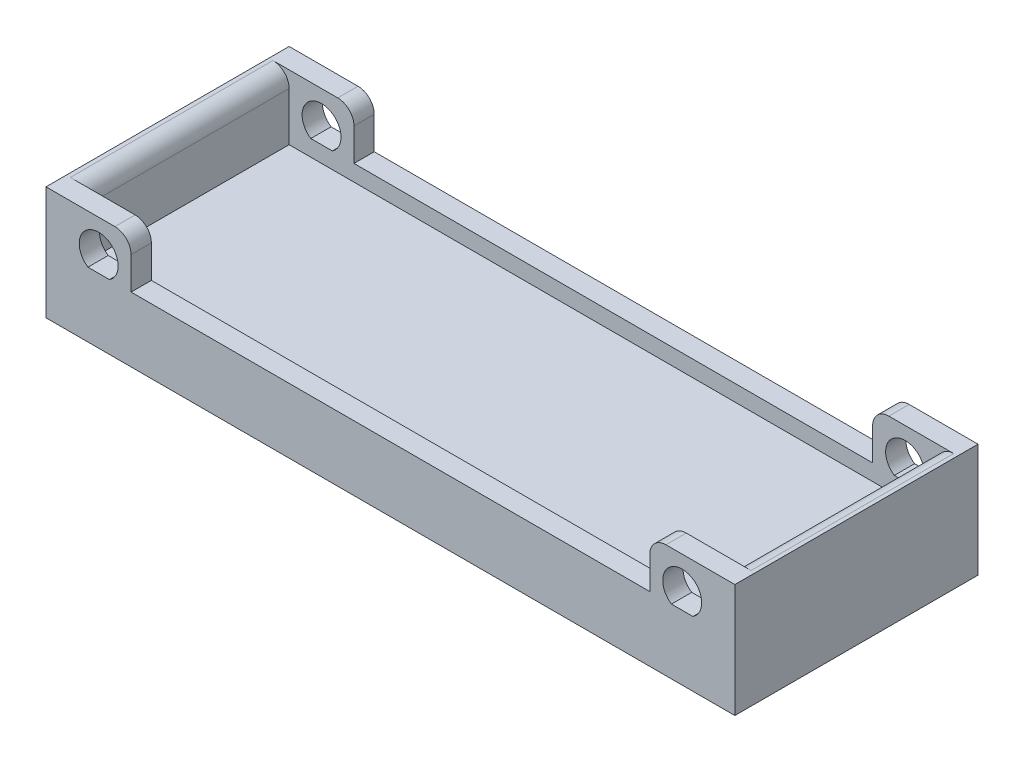
ISO-10303-21;
HEADER;
FILE_DESCRIPTION(('STEP AP214'),'2;1');
FILE_NAME('part.step','',(''),(''),'','','');
FILE_SCHEMA(('AUTOMOTIVE_DESIGN { 1 0 10303 214 1 1 1 1 }'));
ENDSEC;
DATA;
#1=APPLICATION_CONTEXT('core data for automotive mechanical design processes');
#2=APPLICATION_PROTOCOL_DEFINITION('international standard','automotive_design',2000,#1);
#3=PRODUCT_CONTEXT('',#1,'mechanical');
#4=PRODUCT('Part','Part','',(#3));
#5=PRODUCT_RELATED_PRODUCT_CATEGORY('part','',(#4));
#6=PRODUCT_DEFINITION_FORMATION('','',#4);
#7=PRODUCT_DEFINITION_CONTEXT('part definition',#1,'design');
#8=PRODUCT_DEFINITION('design','',#6,#7);
#9=PRODUCT_DEFINITION_SHAPE('','',#8);
#10=(LENGTH_UNIT() NAMED_UNIT(*) SI_UNIT(.MILLI.,.METRE.));
#11=(NAMED_UNIT(*) PLANE_ANGLE_UNIT() SI_UNIT($,.RADIAN.));
#12=(NAMED_UNIT(*) SI_UNIT($,.STERADIAN.) SOLID_ANGLE_UNIT());
#13=UNCERTAINTY_MEASURE_WITH_UNIT(LENGTH_MEASURE(1.E-05),#10,'distance_accuracy_value','');
#14=(GEOMETRIC_REPRESENTATION_CONTEXT(3) GLOBAL_UNCERTAINTY_ASSIGNED_CONTEXT((#13)) GLOBAL_UNIT_ASSIGNED_CONTEXT((#10,
#11,#12)) REPRESENTATION_CONTEXT('',''));
#15=CARTESIAN_POINT('',(0.,0.,0.));
#16=DIRECTION('',(0.,0.,1.));
#17=DIRECTION('',(1.,0.,0.));
#18=AXIS2_PLACEMENT_3D('',#15,#16,#17);
#19=CARTESIAN_POINT('',(42.5,4.,30.));
#20=DIRECTION('',(0.,-1.,0.));
#21=DIRECTION('',(1.,0.,0.));
#22=AXIS2_PLACEMENT_3D('',#19,#20,#21);
#23=PLANE('',#22);
#24=DIRECTION('',(0.,0.,1.));
#25=VECTOR('',#24,1.);
#26=CARTESIAN_POINT('',(37.3266499161422,4.,30.));
#27=LINE('',#26,#25);
#28=CARTESIAN_POINT('',(37.3266499161422,4.,0.));
#29=VERTEX_POINT('',#28);
#30=CARTESIAN_POINT('',(37.3266499161422,4.,2.5));
#31=VERTEX_POINT('',#30);
#32=EDGE_CURVE('E339',#29,#31,#27,.T.);
#33=ORIENTED_EDGE('',*,*,#32,.F.);
#34=DIRECTION('',(-1.,0.,0.));
#35=VECTOR('',#34,1.);
#36=CARTESIAN_POINT('',(42.5,4.,0.));
#37=LINE('',#36,#35);
#38=CARTESIAN_POINT('',(34.6733500838578,4.,0.));
#39=VERTEX_POINT('',#38);
#40=EDGE_CURVE('E411',#29,#39,#37,.T.);
#41=ORIENTED_EDGE('',*,*,#40,.T.);
#42=DIRECTION('',(0.,0.,1.));
#43=VECTOR('',#42,1.);
#44=CARTESIAN_POINT('',(34.6733500838578,4.,30.));
#45=LINE('',#44,#43);
#46=CARTESIAN_POINT('',(34.6733500838578,4.,2.5));
#47=VERTEX_POINT('',#46);
#48=EDGE_CURVE('E336',#47,#39,#45,.F.);
#49=ORIENTED_EDGE('',*,*,#48,.F.);
#50=DIRECTION('',(-1.,0.,0.));
#51=VECTOR('',#50,1.);
#52=CARTESIAN_POINT('',(40.,4.,2.5));
#53=LINE('',#52,#51);
#54=EDGE_CURVE('E385',#31,#47,#53,.T.);
#55=ORIENTED_EDGE('',*,*,#54,.F.);
#56=EDGE_LOOP('',(#33,#41,#49,#55));
#57=FACE_BOUND('',#56,.T.);
#58=ADVANCED_FACE('F35',(#57),#23,.F.);
#59=DIRECTION('',(0.,0.,1.));
#60=VECTOR('',#59,1.);
#61=CARTESIAN_POINT('',(37.3266499161422,4.,30.));
#62=LINE('',#61,#60);
#63=CARTESIAN_POINT('',(37.3266499161422,4.,27.5));
#64=VERTEX_POINT('',#63);
#65=CARTESIAN_POINT('',(37.3266499161422,4.,30.));
#66=VERTEX_POINT('',#65);
#67=EDGE_CURVE('E333',#64,#66,#62,.T.);
#68=ORIENTED_EDGE('',*,*,#67,.F.);
#69=DIRECTION('',(1.,0.,0.));
#70=VECTOR('',#69,1.);
#71=CARTESIAN_POINT('',(40.,4.,27.5));
#72=LINE('',#71,#70);
#73=CARTESIAN_POINT('',(34.6733500838578,4.,27.5));
#74=VERTEX_POINT('',#73);
#75=EDGE_CURVE('E380',#74,#64,#72,.T.);
#76=ORIENTED_EDGE('',*,*,#75,.F.);
#77=DIRECTION('',(0.,0.,1.));
#78=VECTOR('',#77,1.);
#79=CARTESIAN_POINT('',(34.6733500838578,4.,30.));
#80=LINE('',#79,#78);
#81=CARTESIAN_POINT('',(34.6733500838578,4.,30.));
#82=VERTEX_POINT('',#81);
#83=EDGE_CURVE('E58',#82,#74,#80,.F.);
#84=ORIENTED_EDGE('',*,*,#83,.F.);
#85=DIRECTION('',(-1.,0.,0.));
#86=VECTOR('',#85,1.);
#87=CARTESIAN_POINT('',(42.5,4.,30.));
#88=LINE('',#87,#86);
#89=EDGE_CURVE('E416',#66,#82,#88,.T.);
#90=ORIENTED_EDGE('',*,*,#89,.F.);
#91=EDGE_LOOP('',(#68,#76,#84,#90));
#92=FACE_BOUND('',#91,.T.);
#93=ADVANCED_FACE('F552',(#92),#23,.F.);
#94=CARTESIAN_POINT('',(32.,4.,2.5));
#95=VERTEX_POINT('',#94);
#96=CARTESIAN_POINT('',(-32.,3.99999999999999,2.50000000000001));
#97=VERTEX_POINT('',#96);
#98=EDGE_CURVE('E398',#95,#97,#53,.T.);
#99=ORIENTED_EDGE('',*,*,#98,.F.);
#100=DIRECTION('',(0.,0.,1.));
#101=VECTOR('',#100,1.);
#102=CARTESIAN_POINT('',(32.,3.99999999999999,0.));
#103=LINE('',#102,#101);
#104=CARTESIAN_POINT('',(32.,4.,0.));
#105=VERTEX_POINT('',#104);
#106=EDGE_CURVE('E271',#105,#95,#103,.T.);
#107=ORIENTED_EDGE('',*,*,#106,.F.);
#108=CARTESIAN_POINT('',(-32.,3.99999999999999,0.));
#109=VERTEX_POINT('',#108);
#110=EDGE_CURVE('E243',#105,#109,#37,.T.);
#111=ORIENTED_EDGE('',*,*,#110,.T.);
#112=DIRECTION('',(0.,0.,1.));
#113=VECTOR('',#112,1.);
#114=CARTESIAN_POINT('',(-32.,3.99999999999999,0.));
#115=LINE('',#114,#113);
#116=EDGE_CURVE('E352',#109,#97,#115,.T.);
#117=ORIENTED_EDGE('',*,*,#116,.T.);
#118=EDGE_LOOP('',(#99,#107,#111,#117));
#119=FACE_BOUND('',#118,.T.);
#120=ADVANCED_FACE('F558',(#119),#23,.F.);
#121=CARTESIAN_POINT('',(-36.,5.99999999999999,30.));
#122=DIRECTION('',(0.,0.,1.));
#123=DIRECTION('',(1.,0.,0.));
#124=AXIS2_PLACEMENT_3D('',#121,#122,#123);
#125=CYLINDRICAL_SURFACE('',#124,2.4);
#126=DIRECTION('',(0.,0.,1.));
#127=VECTOR('',#126,1.);
#128=CARTESIAN_POINT('',(-34.6733500838578,4.,30.));
#129=LINE('',#128,#127);
#130=CARTESIAN_POINT('',(-34.6733500838578,4.,2.5));
#131=VERTEX_POINT('',#130);
#132=CARTESIAN_POINT('',(-34.6733500838578,4.,0.));
#133=VERTEX_POINT('',#132);
#134=EDGE_CURVE('E330',#131,#133,#129,.F.);
#135=ORIENTED_EDGE('',*,*,#134,.F.);
#136=CARTESIAN_POINT('',(-36.,5.99999999999999,2.50000000000001));
#137=DIRECTION('',(0.,0.,-1.));
#138=DIRECTION('',(-1.,0.,0.));
#139=AXIS2_PLACEMENT_3D('',#136,#137,#138);
#140=CIRCLE('',#139,2.4);
#141=CARTESIAN_POINT('',(-37.3266499161422,4.,2.50000000000001));
#142=VERTEX_POINT('',#141);
#143=EDGE_CURVE('E348',#142,#131,#140,.T.);
#144=ORIENTED_EDGE('',*,*,#143,.F.);
#145=DIRECTION('',(0.,0.,1.));
#146=VECTOR('',#145,1.);
#147=CARTESIAN_POINT('',(-37.3266499161422,4.,30.));
#148=LINE('',#147,#146);
#149=CARTESIAN_POINT('',(-37.3266499161422,4.,0.));
#150=VERTEX_POINT('',#149);
#151=EDGE_CURVE('E327',#150,#142,#148,.T.);
#152=ORIENTED_EDGE('',*,*,#151,.F.);
#153=CARTESIAN_POINT('',(-36.,5.99999999999999,0.));
#154=DIRECTION('',(0.,0.,1.));
#155=DIRECTION('',(1.,0.,0.));
#156=AXIS2_PLACEMENT_3D('',#153,#154,#155);
#157=CIRCLE('',#156,2.4);
#158=EDGE_CURVE('E345',#133,#150,#157,.T.);
#159=ORIENTED_EDGE('',*,*,#158,.F.);
#160=EDGE_LOOP('',(#135,#144,#152,#159));
#161=FACE_BOUND('',#160,.T.);
#162=ADVANCED_FACE('F548',(#161),#125,.F.);
#163=DIRECTION('',(0.,0.,1.));
#164=VECTOR('',#163,1.);
#165=CARTESIAN_POINT('',(-34.6733500838578,4.,30.));
#166=LINE('',#165,#164);
#167=CARTESIAN_POINT('',(-34.6733500838578,4.,30.));
#168=VERTEX_POINT('',#167);
#169=CARTESIAN_POINT('',(-34.6733500838578,4.,27.5));
#170=VERTEX_POINT('',#169);
#171=EDGE_CURVE('E11',#168,#170,#166,.F.);
#172=ORIENTED_EDGE('',*,*,#171,.F.);
#173=CARTESIAN_POINT('',(-36.,5.99999999999999,30.));
#174=DIRECTION('',(0.,0.,1.));
#175=DIRECTION('',(1.,0.,0.));
#176=AXIS2_PLACEMENT_3D('',#173,#174,#175);
#177=CIRCLE('',#176,2.4);
#178=CARTESIAN_POINT('',(-37.3266499161422,4.,30.));
#179=VERTEX_POINT('',#178);
#180=EDGE_CURVE('E342',#168,#179,#177,.T.);
#181=ORIENTED_EDGE('',*,*,#180,.T.);
#182=DIRECTION('',(0.,0.,1.));
#183=VECTOR('',#182,1.);
#184=CARTESIAN_POINT('',(-37.3266499161422,4.,30.));
#185=LINE('',#184,#183);
#186=CARTESIAN_POINT('',(-37.3266499161422,4.,27.5));
#187=VERTEX_POINT('',#186);
#188=EDGE_CURVE('E43',#187,#179,#185,.T.);
#189=ORIENTED_EDGE('',*,*,#188,.F.);
#190=CARTESIAN_POINT('',(-36.,5.99999999999999,27.5));
#191=DIRECTION('',(0.,0.,1.));
#192=DIRECTION('',(1.,0.,0.));
#193=AXIS2_PLACEMENT_3D('',#190,#191,#192);
#194=CIRCLE('',#193,2.4);
#195=EDGE_CURVE('E349',#170,#187,#194,.T.);
#196=ORIENTED_EDGE('',*,*,#195,.F.);
#197=EDGE_LOOP('',(#172,#181,#189,#196));
#198=FACE_BOUND('',#197,.T.);
#199=ADVANCED_FACE('F466',(#198),#125,.F.);
#200=CARTESIAN_POINT('',(-42.5,-4.00000000000001,30.));
#201=DIRECTION('',(1.,0.,0.));
#202=DIRECTION('',(0.,0.,-1.));
#203=AXIS2_PLACEMENT_3D('',#200,#201,#202);
#204=PLANE('',#203);
#205=DIRECTION('',(0.,0.,-1.));
#206=VECTOR('',#205,1.);
#207=CARTESIAN_POINT('',(-42.5,-4.00000000000001,30.));
#208=LINE('',#207,#206);
#209=CARTESIAN_POINT('',(-42.5,-4.00000000000001,30.));
#210=VERTEX_POINT('',#209);
#211=CARTESIAN_POINT('',(-42.5,-4.00000000000001,0.));
#212=VERTEX_POINT('',#211);
#213=EDGE_CURVE('E421',#210,#212,#208,.T.);
#214=ORIENTED_EDGE('',*,*,#213,.F.);
#215=DIRECTION('',(0.,-1.,0.));
#216=VECTOR('',#215,1.);
#217=CARTESIAN_POINT('',(-42.5,-4.00000000000001,30.));
#218=LINE('',#217,#216);
#219=CARTESIAN_POINT('',(-42.5,9.99999999999999,30.));
#220=VERTEX_POINT('',#219);
#221=EDGE_CURVE('E408',#220,#210,#218,.T.);
#222=ORIENTED_EDGE('',*,*,#221,.F.);
#223=DIRECTION('',(0.,0.,1.));
#224=VECTOR('',#223,1.);
#225=CARTESIAN_POINT('',(-42.5,9.99999999999999,0.));
#226=LINE('',#225,#224);
#227=CARTESIAN_POINT('',(-42.5,9.99999999999999,0.));
#228=VERTEX_POINT('',#227);
#229=EDGE_CURVE('E355',#228,#220,#226,.T.);
#230=ORIENTED_EDGE('',*,*,#229,.F.);
#231=DIRECTION('',(0.,-1.,0.));
#232=VECTOR('',#231,1.);
#233=CARTESIAN_POINT('',(-42.5,-4.00000000000001,0.));
#234=LINE('',#233,#232);
#235=EDGE_CURVE('E402',#228,#212,#234,.T.);
#236=ORIENTED_EDGE('',*,*,#235,.T.);
#237=EDGE_LOOP('',(#214,#222,#230,#236));
#238=FACE_BOUND('',#237,.T.);
#239=ADVANCED_FACE('F540',(#238),#204,.F.);
#240=CARTESIAN_POINT('',(42.5,-4.,30.));
#241=DIRECTION('',(0.,1.,0.));
#242=DIRECTION('',(-1.,0.,0.));
#243=AXIS2_PLACEMENT_3D('',#240,#241,#242);
#244=PLANE('',#243);
#245=DIRECTION('',(1.,0.,0.));
#246=VECTOR('',#245,1.);
#247=CARTESIAN_POINT('',(42.5,-4.,0.));
#248=LINE('',#247,#246);
#249=CARTESIAN_POINT('',(42.5,-4.,0.));
#250=VERTEX_POINT('',#249);
#251=EDGE_CURVE('E244',#212,#250,#248,.T.);
#252=ORIENTED_EDGE('',*,*,#251,.T.);
#253=DIRECTION('',(0.,0.,-1.));
#254=VECTOR('',#253,1.);
#255=CARTESIAN_POINT('',(42.5,-4.,30.));
#256=LINE('',#255,#254);
#257=CARTESIAN_POINT('',(42.5,-4.,30.));
#258=VERTEX_POINT('',#257);
#259=EDGE_CURVE('E240',#258,#250,#256,.T.);
#260=ORIENTED_EDGE('',*,*,#259,.F.);
#261=DIRECTION('',(1.,0.,0.));
#262=VECTOR('',#261,1.);
#263=CARTESIAN_POINT('',(42.5,-4.,30.));
#264=LINE('',#263,#262);
#265=EDGE_CURVE('E410',#210,#258,#264,.T.);
#266=ORIENTED_EDGE('',*,*,#265,.F.);
#267=ORIENTED_EDGE('',*,*,#213,.T.);
#268=EDGE_LOOP('',(#252,#260,#266,#267));
#269=FACE_BOUND('',#268,.T.);
#270=ADVANCED_FACE('F539',(#269),#244,.F.);
#271=CARTESIAN_POINT('',(42.5,-4.,30.));
#272=DIRECTION('',(-1.,0.,0.));
#273=DIRECTION('',(0.,0.,1.));
#274=AXIS2_PLACEMENT_3D('',#271,#272,#273);
#275=PLANE('',#274);
#276=DIRECTION('',(0.,1.,0.));
#277=VECTOR('',#276,1.);
#278=CARTESIAN_POINT('',(42.5,-4.,0.));
#279=LINE('',#278,#277);
#280=CARTESIAN_POINT('',(42.5,9.99999999999999,0.));
#281=VERTEX_POINT('',#280);
#282=EDGE_CURVE('E233',#250,#281,#279,.T.);
#283=ORIENTED_EDGE('',*,*,#282,.T.);
#284=DIRECTION('',(0.,0.,1.));
#285=VECTOR('',#284,1.);
#286=CARTESIAN_POINT('',(42.5,9.99999999999999,0.));
#287=LINE('',#286,#285);
#288=CARTESIAN_POINT('',(42.5,9.99999999999999,30.));
#289=VERTEX_POINT('',#288);
#290=EDGE_CURVE('E238',#281,#289,#287,.T.);
#291=ORIENTED_EDGE('',*,*,#290,.T.);
#292=DIRECTION('',(0.,1.,0.));
#293=VECTOR('',#292,1.);
#294=CARTESIAN_POINT('',(42.5,-4.,30.));
#295=LINE('',#294,#293);
#296=EDGE_CURVE('E413',#258,#289,#295,.T.);
#297=ORIENTED_EDGE('',*,*,#296,.F.);
#298=ORIENTED_EDGE('',*,*,#259,.T.);
#299=EDGE_LOOP('',(#283,#291,#297,#298));
#300=FACE_BOUND('',#299,.T.);
#301=ADVANCED_FACE('F235',(#300),#275,.F.);
#302=CARTESIAN_POINT('',(32.,4.,30.));
#303=VERTEX_POINT('',#302);
#304=CARTESIAN_POINT('',(-32.,3.99999999999999,30.));
#305=VERTEX_POINT('',#304);
#306=EDGE_CURVE('E50',#303,#305,#88,.T.);
#307=ORIENTED_EDGE('',*,*,#306,.F.);
#308=CARTESIAN_POINT('',(32.,4.,27.5));
#309=VERTEX_POINT('',#308);
#310=EDGE_CURVE('E254',#309,#303,#103,.T.);
#311=ORIENTED_EDGE('',*,*,#310,.F.);
#312=CARTESIAN_POINT('',(-32.,3.99999999999999,27.5));
#313=VERTEX_POINT('',#312);
#314=EDGE_CURVE('E395',#313,#309,#72,.T.);
#315=ORIENTED_EDGE('',*,*,#314,.F.);
#316=EDGE_CURVE('E356',#313,#305,#115,.T.);
#317=ORIENTED_EDGE('',*,*,#316,.T.);
#318=EDGE_LOOP('',(#307,#311,#315,#317));
#319=FACE_BOUND('',#318,.T.);
#320=ADVANCED_FACE('F506',(#319),#23,.F.);
#321=CARTESIAN_POINT('',(0.,0.,30.));
#322=DIRECTION('',(0.,0.,1.));
#323=DIRECTION('',(1.,0.,0.));
#324=AXIS2_PLACEMENT_3D('',#321,#322,#323);
#325=PLANE('',#324);
#326=CARTESIAN_POINT('',(36.,5.99999999999999,30.));
#327=DIRECTION('',(0.,0.,-1.));
#328=DIRECTION('',(-1.,0.,0.));
#329=AXIS2_PLACEMENT_3D('',#326,#327,#328);
#330=CIRCLE('',#329,2.4);
#331=EDGE_CURVE('E913',#82,#66,#330,.T.);
#332=ORIENTED_EDGE('',*,*,#331,.T.);
#333=ORIENTED_EDGE('',*,*,#89,.T.);
#334=EDGE_LOOP('',(#332,#333));
#335=FACE_BOUND('',#334,.T.);
#336=DIRECTION('',(1.,0.,0.));
#337=VECTOR('',#336,1.);
#338=CARTESIAN_POINT('',(-42.5,4.,30.));
#339=LINE('',#338,#337);
#340=EDGE_CURVE('E290',#179,#168,#339,.T.);
#341=ORIENTED_EDGE('',*,*,#340,.F.);
#342=ORIENTED_EDGE('',*,*,#180,.F.);
#343=EDGE_LOOP('',(#341,#342));
#344=FACE_BOUND('',#343,.T.);
#345=ORIENTED_EDGE('',*,*,#221,.T.);
#346=ORIENTED_EDGE('',*,*,#265,.T.);
#347=ORIENTED_EDGE('',*,*,#296,.T.);
#348=DIRECTION('',(-1.,0.,0.));
#349=VECTOR('',#348,1.);
#350=CARTESIAN_POINT('',(0.,10.,30.));
#351=LINE('',#350,#349);
#352=CARTESIAN_POINT('',(34.,9.99999999999999,30.));
#353=VERTEX_POINT('',#352);
#354=EDGE_CURVE('E259',#289,#353,#351,.T.);
#355=ORIENTED_EDGE('',*,*,#354,.T.);
#356=CARTESIAN_POINT('',(34.,7.99999999999999,30.));
#357=DIRECTION('',(0.,0.,-1.));
#358=DIRECTION('',(-1.,0.,0.));
#359=AXIS2_PLACEMENT_3D('',#356,#357,#358);
#360=CIRCLE('',#359,2.);
#361=CARTESIAN_POINT('',(32.,7.99999999999999,30.));
#362=VERTEX_POINT('',#361);
#363=EDGE_CURVE('E315',#362,#353,#360,.T.);
#364=ORIENTED_EDGE('',*,*,#363,.F.);
#365=DIRECTION('',(0.,-1.,0.));
#366=VECTOR('',#365,1.);
#367=CARTESIAN_POINT('',(32.,9.99999999999999,30.));
#368=LINE('',#367,#366);
#369=EDGE_CURVE('E280',#362,#303,#368,.T.);
#370=ORIENTED_EDGE('',*,*,#369,.T.);
#371=ORIENTED_EDGE('',*,*,#306,.T.);
#372=DIRECTION('',(0.,-1.,0.));
#373=VECTOR('',#372,1.);
#374=CARTESIAN_POINT('',(-32.,9.99999999999999,30.));
#375=LINE('',#374,#373);
#376=CARTESIAN_POINT('',(-32.,7.99999999999999,30.));
#377=VERTEX_POINT('',#376);
#378=EDGE_CURVE('E374',#377,#305,#375,.T.);
#379=ORIENTED_EDGE('',*,*,#378,.F.);
#380=CARTESIAN_POINT('',(-34.,7.99999999999999,30.));
#381=DIRECTION('',(0.,0.,1.));
#382=DIRECTION('',(1.,0.,0.));
#383=AXIS2_PLACEMENT_3D('',#380,#381,#382);
#384=CIRCLE('',#383,2.);
#385=CARTESIAN_POINT('',(-34.,9.99999999999999,30.));
#386=VERTEX_POINT('',#385);
#387=EDGE_CURVE('E446',#377,#386,#384,.T.);
#388=ORIENTED_EDGE('',*,*,#387,.T.);
#389=DIRECTION('',(1.,0.,0.));
#390=VECTOR('',#389,1.);
#391=CARTESIAN_POINT('',(0.,10.,30.));
#392=LINE('',#391,#390);
#393=EDGE_CURVE('E359',#220,#386,#392,.T.);
#394=ORIENTED_EDGE('',*,*,#393,.F.);
#395=EDGE_LOOP('',(#345,#346,#347,#355,#364,#370,#371,#379,#388,#394));
#396=FACE_BOUND('',#395,.T.);
#397=ADVANCED_FACE('F464',(#335,#344,#396),#325,.T.);
#398=CARTESIAN_POINT('',(0.,0.,0.));
#399=DIRECTION('',(0.,0.,1.));
#400=DIRECTION('',(1.,0.,0.));
#401=AXIS2_PLACEMENT_3D('',#398,#399,#400);
#402=PLANE('',#401);
#403=ORIENTED_EDGE('',*,*,#40,.F.);
#404=CARTESIAN_POINT('',(36.,5.99999999999999,0.));
#405=DIRECTION('',(0.,0.,-1.));
#406=DIRECTION('',(-1.,0.,0.));
#407=AXIS2_PLACEMENT_3D('',#404,#405,#406);
#408=CIRCLE('',#407,2.4);
#409=EDGE_CURVE('E298',#39,#29,#408,.T.);
#410=ORIENTED_EDGE('',*,*,#409,.F.);
#411=EDGE_LOOP('',(#403,#410));
#412=FACE_BOUND('',#411,.T.);
#413=ORIENTED_EDGE('',*,*,#158,.T.);
#414=DIRECTION('',(1.,0.,0.));
#415=VECTOR('',#414,1.);
#416=CARTESIAN_POINT('',(-42.5,4.,0.));
#417=LINE('',#416,#415);
#418=EDGE_CURVE('E289',#150,#133,#417,.T.);
#419=ORIENTED_EDGE('',*,*,#418,.T.);
#420=EDGE_LOOP('',(#413,#419));
#421=FACE_BOUND('',#420,.T.);
#422=ORIENTED_EDGE('',*,*,#251,.F.);
#423=ORIENTED_EDGE('',*,*,#235,.F.);
#424=DIRECTION('',(-1.,0.,0.));
#425=VECTOR('',#424,1.);
#426=CARTESIAN_POINT('',(0.,10.,0.));
#427=LINE('',#426,#425);
#428=CARTESIAN_POINT('',(-34.,9.99999999999999,0.));
#429=VERTEX_POINT('',#428);
#430=EDGE_CURVE('E353',#429,#228,#427,.T.);
#431=ORIENTED_EDGE('',*,*,#430,.F.);
#432=CARTESIAN_POINT('',(-34.,7.99999999999999,0.));
#433=DIRECTION('',(0.,0.,1.));
#434=DIRECTION('',(1.,0.,0.));
#435=AXIS2_PLACEMENT_3D('',#432,#433,#434);
#436=CIRCLE('',#435,2.);
#437=CARTESIAN_POINT('',(-32.,7.99999999999999,0.));
#438=VERTEX_POINT('',#437);
#439=EDGE_CURVE('E441',#429,#438,#436,.F.);
#440=ORIENTED_EDGE('',*,*,#439,.T.);
#441=DIRECTION('',(0.,-1.,0.));
#442=VECTOR('',#441,1.);
#443=CARTESIAN_POINT('',(-32.,9.99999999999999,0.));
#444=LINE('',#443,#442);
#445=EDGE_CURVE('E377',#438,#109,#444,.T.);
#446=ORIENTED_EDGE('',*,*,#445,.T.);
#447=ORIENTED_EDGE('',*,*,#110,.F.);
#448=DIRECTION('',(0.,-1.,0.));
#449=VECTOR('',#448,1.);
#450=CARTESIAN_POINT('',(32.,9.99999999999999,0.));
#451=LINE('',#450,#449);
#452=CARTESIAN_POINT('',(32.,7.99999999999999,0.));
#453=VERTEX_POINT('',#452);
#454=EDGE_CURVE('E282',#453,#105,#451,.T.);
#455=ORIENTED_EDGE('',*,*,#454,.F.);
#456=CARTESIAN_POINT('',(34.,7.99999999999999,0.));
#457=DIRECTION('',(0.,0.,-1.));
#458=DIRECTION('',(-1.,0.,0.));
#459=AXIS2_PLACEMENT_3D('',#456,#457,#458);
#460=CIRCLE('',#459,2.);
#461=CARTESIAN_POINT('',(34.,9.99999999999999,0.));
#462=VERTEX_POINT('',#461);
#463=EDGE_CURVE('E252',#462,#453,#460,.F.);
#464=ORIENTED_EDGE('',*,*,#463,.F.);
#465=DIRECTION('',(1.,0.,0.));
#466=VECTOR('',#465,1.);
#467=CARTESIAN_POINT('',(0.,10.,0.));
#468=LINE('',#467,#466);
#469=EDGE_CURVE('E248',#462,#281,#468,.T.);
#470=ORIENTED_EDGE('',*,*,#469,.T.);
#471=ORIENTED_EDGE('',*,*,#282,.F.);
#472=EDGE_LOOP('',(#422,#423,#431,#440,#446,#447,#455,#464,#470,#471));
#473=FACE_BOUND('',#472,.T.);
#474=ADVANCED_FACE('F249',(#412,#421,#473),#402,.F.);
#475=CARTESIAN_POINT('',(-40.,1.99999999999999,27.5));
#476=DIRECTION('',(-1.,0.,0.));
#477=DIRECTION('',(0.,0.,1.));
#478=AXIS2_PLACEMENT_3D('',#475,#476,#477);
#479=PLANE('',#478);
#480=DIRECTION('',(0.,1.,0.));
#481=VECTOR('',#480,1.);
#482=CARTESIAN_POINT('',(-40.,1.99999999999999,2.50000000000001));
#483=LINE('',#482,#481);
#484=CARTESIAN_POINT('',(-40.,1.99999999999999,2.50000000000001));
#485=VERTEX_POINT('',#484);
#486=CARTESIAN_POINT('',(-40.,7.99999999999999,2.50000000000001));
#487=VERTEX_POINT('',#486);
#488=EDGE_CURVE('E400',#485,#487,#483,.T.);
#489=ORIENTED_EDGE('',*,*,#488,.T.);
#490=DIRECTION('',(0.,0.,-1.));
#491=VECTOR('',#490,1.);
#492=CARTESIAN_POINT('',(-40.,7.99999999999999,27.5));
#493=LINE('',#492,#491);
#494=CARTESIAN_POINT('',(-40.,7.99999999999999,27.5));
#495=VERTEX_POINT('',#494);
#496=EDGE_CURVE('E433',#487,#495,#493,.F.);
#497=ORIENTED_EDGE('',*,*,#496,.T.);
#498=DIRECTION('',(0.,1.,0.));
#499=VECTOR('',#498,1.);
#500=CARTESIAN_POINT('',(-40.,1.99999999999999,27.5));
#501=LINE('',#500,#499);
#502=CARTESIAN_POINT('',(-40.,1.99999999999999,27.5));
#503=VERTEX_POINT('',#502);
#504=EDGE_CURVE('E394',#503,#495,#501,.T.);
#505=ORIENTED_EDGE('',*,*,#504,.F.);
#506=DIRECTION('',(0.,0.,1.));
#507=VECTOR('',#506,1.);
#508=CARTESIAN_POINT('',(-40.,1.99999999999999,27.5));
#509=LINE('',#508,#507);
#510=EDGE_CURVE('E381',#485,#503,#509,.T.);
#511=ORIENTED_EDGE('',*,*,#510,.F.);
#512=EDGE_LOOP('',(#489,#497,#505,#511));
#513=FACE_BOUND('',#512,.T.);
#514=ADVANCED_FACE('F482',(#513),#479,.F.);
#515=CARTESIAN_POINT('',(40.,2.,2.5));
#516=DIRECTION('',(0.,0.,-1.));
#517=DIRECTION('',(-1.,0.,0.));
#518=AXIS2_PLACEMENT_3D('',#515,#516,#517);
#519=PLANE('',#518);
#520=ORIENTED_EDGE('',*,*,#54,.T.);
#521=CARTESIAN_POINT('',(36.,5.99999999999999,2.50000000000001));
#522=DIRECTION('',(0.,0.,1.));
#523=DIRECTION('',(1.,0.,0.));
#524=AXIS2_PLACEMENT_3D('',#521,#522,#523);
#525=CIRCLE('',#524,2.4);
#526=EDGE_CURVE('E295',#31,#47,#525,.T.);
#527=ORIENTED_EDGE('',*,*,#526,.F.);
#528=EDGE_LOOP('',(#520,#527));
#529=FACE_BOUND('',#528,.T.);
#530=ORIENTED_EDGE('',*,*,#143,.T.);
#531=DIRECTION('',(1.,0.,0.));
#532=VECTOR('',#531,1.);
#533=CARTESIAN_POINT('',(-40.,4.,2.5));
#534=LINE('',#533,#532);
#535=EDGE_CURVE('E287',#142,#131,#534,.T.);
#536=ORIENTED_EDGE('',*,*,#535,.F.);
#537=EDGE_LOOP('',(#530,#536));
#538=FACE_BOUND('',#537,.T.);
#539=ORIENTED_EDGE('',*,*,#98,.T.);
#540=DIRECTION('',(0.,-1.,0.));
#541=VECTOR('',#540,1.);
#542=CARTESIAN_POINT('',(-32.,9.99999999999999,2.50000000000001));
#543=LINE('',#542,#541);
#544=CARTESIAN_POINT('',(-32.,7.99999999999999,2.50000000000001));
#545=VERTEX_POINT('',#544);
#546=EDGE_CURVE('E367',#545,#97,#543,.T.);
#547=ORIENTED_EDGE('',*,*,#546,.F.);
#548=CARTESIAN_POINT('',(-34.,7.99999999999999,2.50000000000001));
#549=DIRECTION('',(0.,0.,-1.));
#550=DIRECTION('',(-1.,0.,0.));
#551=AXIS2_PLACEMENT_3D('',#548,#549,#550);
#552=CIRCLE('',#551,2.);
#553=CARTESIAN_POINT('',(-34.,9.99999999999999,2.50000000000001));
#554=VERTEX_POINT('',#553);
#555=EDGE_CURVE('E439',#545,#554,#552,.F.);
#556=ORIENTED_EDGE('',*,*,#555,.T.);
#557=DIRECTION('',(1.,0.,0.));
#558=VECTOR('',#557,1.);
#559=CARTESIAN_POINT('',(0.,10.,2.5));
#560=LINE('',#559,#558);
#561=CARTESIAN_POINT('',(-42.,9.99999999999999,2.50000000000001));
#562=VERTEX_POINT('',#561);
#563=EDGE_CURVE('E364',#562,#554,#560,.T.);
#564=ORIENTED_EDGE('',*,*,#563,.F.);
#565=CARTESIAN_POINT('',(-42.,7.99999999999999,2.50000000000001));
#566=DIRECTION('',(0.,0.,-1.));
#567=DIRECTION('',(-1.,0.,0.));
#568=AXIS2_PLACEMENT_3D('',#565,#566,#567);
#569=CIRCLE('',#568,2.);
#570=EDGE_CURVE('E450',#562,#487,#569,.T.);
#571=ORIENTED_EDGE('',*,*,#570,.T.);
#572=ORIENTED_EDGE('',*,*,#488,.F.);
#573=DIRECTION('',(-1.,0.,0.));
#574=VECTOR('',#573,1.);
#575=CARTESIAN_POINT('',(40.,2.,2.5));
#576=LINE('',#575,#574);
#577=CARTESIAN_POINT('',(40.,2.,2.5));
#578=VERTEX_POINT('',#577);
#579=EDGE_CURVE('E391',#578,#485,#576,.T.);
#580=ORIENTED_EDGE('',*,*,#579,.F.);
#581=DIRECTION('',(0.,1.,0.));
#582=VECTOR('',#581,1.);
#583=CARTESIAN_POINT('',(40.,2.,2.5));
#584=LINE('',#583,#582);
#585=CARTESIAN_POINT('',(40.,7.99999999999999,2.50000000000001));
#586=VERTEX_POINT('',#585);
#587=EDGE_CURVE('E403',#578,#586,#584,.T.);
#588=ORIENTED_EDGE('',*,*,#587,.T.);
#589=CARTESIAN_POINT('',(42.,7.99999999999999,2.50000000000001));
#590=DIRECTION('',(0.,0.,1.));
#591=DIRECTION('',(1.,0.,0.));
#592=AXIS2_PLACEMENT_3D('',#589,#590,#591);
#593=CIRCLE('',#592,2.);
#594=CARTESIAN_POINT('',(42.,9.99999999999999,2.50000000000001));
#595=VERTEX_POINT('',#594);
#596=EDGE_CURVE('E321',#595,#586,#593,.T.);
#597=ORIENTED_EDGE('',*,*,#596,.F.);
#598=DIRECTION('',(-1.,0.,0.));
#599=VECTOR('',#598,1.);
#600=CARTESIAN_POINT('',(0.,10.,2.5));
#601=LINE('',#600,#599);
#602=CARTESIAN_POINT('',(34.,9.99999999999999,2.50000000000001));
#603=VERTEX_POINT('',#602);
#604=EDGE_CURVE('E267',#595,#603,#601,.T.);
#605=ORIENTED_EDGE('',*,*,#604,.T.);
#606=CARTESIAN_POINT('',(34.,7.99999999999999,2.50000000000001));
#607=DIRECTION('',(0.,0.,1.));
#608=DIRECTION('',(1.,0.,0.));
#609=AXIS2_PLACEMENT_3D('',#606,#607,#608);
#610=CIRCLE('',#609,2.);
#611=CARTESIAN_POINT('',(32.,7.99999999999999,2.50000000000001));
#612=VERTEX_POINT('',#611);
#613=EDGE_CURVE('E309',#612,#603,#610,.F.);
#614=ORIENTED_EDGE('',*,*,#613,.F.);
#615=DIRECTION('',(0.,-1.,0.));
#616=VECTOR('',#615,1.);
#617=CARTESIAN_POINT('',(32.,9.99999999999999,2.50000000000001));
#618=LINE('',#617,#616);
#619=EDGE_CURVE('E270',#612,#95,#618,.T.);
#620=ORIENTED_EDGE('',*,*,#619,.T.);
#621=EDGE_LOOP('',(#539,#547,#556,#564,#571,#572,#580,#588,#597,#605,#614,#620));
#622=FACE_BOUND('',#621,.T.);
#623=ADVANCED_FACE('F521',(#529,#538,#622),#519,.F.);
#624=CARTESIAN_POINT('',(40.,2.,27.5));
#625=DIRECTION('',(1.,0.,0.));
#626=DIRECTION('',(0.,1.,0.));
#627=AXIS2_PLACEMENT_3D('',#624,#625,#626);
#628=PLANE('',#627);
#629=DIRECTION('',(0.,1.,0.));
#630=VECTOR('',#629,1.);
#631=CARTESIAN_POINT('',(40.,2.,27.5));
#632=LINE('',#631,#630);
#633=CARTESIAN_POINT('',(40.,2.,27.5));
#634=VERTEX_POINT('',#633);
#635=CARTESIAN_POINT('',(40.,7.99999999999999,27.5));
#636=VERTEX_POINT('',#635);
#637=EDGE_CURVE('E405',#634,#636,#632,.T.);
#638=ORIENTED_EDGE('',*,*,#637,.T.);
#639=DIRECTION('',(0.,0.,-1.));
#640=VECTOR('',#639,1.);
#641=CARTESIAN_POINT('',(40.,7.99999999999999,27.5));
#642=LINE('',#641,#640);
#643=EDGE_CURVE('E304',#586,#636,#642,.F.);
#644=ORIENTED_EDGE('',*,*,#643,.F.);
#645=ORIENTED_EDGE('',*,*,#587,.F.);
#646=DIRECTION('',(0.,0.,-1.));
#647=VECTOR('',#646,1.);
#648=CARTESIAN_POINT('',(40.,2.,27.5));
#649=LINE('',#648,#647);
#650=EDGE_CURVE('E388',#634,#578,#649,.T.);
#651=ORIENTED_EDGE('',*,*,#650,.F.);
#652=EDGE_LOOP('',(#638,#644,#645,#651));
#653=FACE_BOUND('',#652,.T.);
#654=ADVANCED_FACE('F472',(#653),#628,.F.);
#655=CARTESIAN_POINT('',(40.,2.,27.5));
#656=DIRECTION('',(0.,0.,1.));
#657=DIRECTION('',(1.,0.,0.));
#658=AXIS2_PLACEMENT_3D('',#655,#656,#657);
#659=PLANE('',#658);
#660=ORIENTED_EDGE('',*,*,#75,.T.);
#661=CARTESIAN_POINT('',(36.,5.99999999999999,27.5));
#662=DIRECTION('',(0.,0.,-1.));
#663=DIRECTION('',(-1.,0.,0.));
#664=AXIS2_PLACEMENT_3D('',#661,#662,#663);
#665=CIRCLE('',#664,2.4);
#666=EDGE_CURVE('E274',#74,#64,#665,.T.);
#667=ORIENTED_EDGE('',*,*,#666,.F.);
#668=EDGE_LOOP('',(#660,#667));
#669=FACE_BOUND('',#668,.T.);
#670=ORIENTED_EDGE('',*,*,#195,.T.);
#671=DIRECTION('',(-1.,0.,0.));
#672=VECTOR('',#671,1.);
#673=CARTESIAN_POINT('',(-40.,4.,27.5));
#674=LINE('',#673,#672);
#675=EDGE_CURVE('E285',#170,#187,#674,.T.);
#676=ORIENTED_EDGE('',*,*,#675,.F.);
#677=EDGE_LOOP('',(#670,#676));
#678=FACE_BOUND('',#677,.T.);
#679=ORIENTED_EDGE('',*,*,#504,.T.);
#680=CARTESIAN_POINT('',(-42.,7.99999999999999,27.5));
#681=DIRECTION('',(0.,0.,1.));
#682=DIRECTION('',(1.,0.,0.));
#683=AXIS2_PLACEMENT_3D('',#680,#681,#682);
#684=CIRCLE('',#683,2.);
#685=CARTESIAN_POINT('',(-42.,9.99999999999999,27.5));
#686=VERTEX_POINT('',#685);
#687=EDGE_CURVE('E453',#495,#686,#684,.T.);
#688=ORIENTED_EDGE('',*,*,#687,.T.);
#689=DIRECTION('',(-1.,0.,0.));
#690=VECTOR('',#689,1.);
#691=CARTESIAN_POINT('',(0.,10.,27.5));
#692=LINE('',#691,#690);
#693=CARTESIAN_POINT('',(-34.,9.99999999999999,27.5));
#694=VERTEX_POINT('',#693);
#695=EDGE_CURVE('E362',#694,#686,#692,.T.);
#696=ORIENTED_EDGE('',*,*,#695,.F.);
#697=CARTESIAN_POINT('',(-34.,7.99999999999999,27.5));
#698=DIRECTION('',(0.,0.,1.));
#699=DIRECTION('',(1.,0.,0.));
#700=AXIS2_PLACEMENT_3D('',#697,#698,#699);
#701=CIRCLE('',#700,2.);
#702=CARTESIAN_POINT('',(-32.,7.99999999999999,27.5));
#703=VERTEX_POINT('',#702);
#704=EDGE_CURVE('E448',#694,#703,#701,.F.);
#705=ORIENTED_EDGE('',*,*,#704,.T.);
#706=DIRECTION('',(0.,-1.,0.));
#707=VECTOR('',#706,1.);
#708=CARTESIAN_POINT('',(-32.,9.99999999999999,27.5));
#709=LINE('',#708,#707);
#710=EDGE_CURVE('E372',#703,#313,#709,.T.);
#711=ORIENTED_EDGE('',*,*,#710,.T.);
#712=ORIENTED_EDGE('',*,*,#314,.T.);
#713=DIRECTION('',(0.,-1.,0.));
#714=VECTOR('',#713,1.);
#715=CARTESIAN_POINT('',(32.,9.99999999999999,27.5));
#716=LINE('',#715,#714);
#717=CARTESIAN_POINT('',(32.,7.99999999999999,27.5));
#718=VERTEX_POINT('',#717);
#719=EDGE_CURVE('E277',#718,#309,#716,.T.);
#720=ORIENTED_EDGE('',*,*,#719,.F.);
#721=CARTESIAN_POINT('',(34.,7.99999999999999,27.5));
#722=DIRECTION('',(0.,0.,-1.));
#723=DIRECTION('',(-1.,0.,0.));
#724=AXIS2_PLACEMENT_3D('',#721,#722,#723);
#725=CIRCLE('',#724,2.);
#726=CARTESIAN_POINT('',(34.,9.99999999999999,27.5));
#727=VERTEX_POINT('',#726);
#728=EDGE_CURVE('E318',#727,#718,#725,.F.);
#729=ORIENTED_EDGE('',*,*,#728,.F.);
#730=DIRECTION('',(1.,0.,0.));
#731=VECTOR('',#730,1.);
#732=CARTESIAN_POINT('',(0.,10.,27.5));
#733=LINE('',#732,#731);
#734=CARTESIAN_POINT('',(42.,9.99999999999999,27.5));
#735=VERTEX_POINT('',#734);
#736=EDGE_CURVE('E261',#727,#735,#733,.T.);
#737=ORIENTED_EDGE('',*,*,#736,.T.);
#738=CARTESIAN_POINT('',(42.,7.99999999999999,27.5));
#739=DIRECTION('',(0.,0.,-1.));
#740=DIRECTION('',(-1.,0.,0.));
#741=AXIS2_PLACEMENT_3D('',#738,#739,#740);
#742=CIRCLE('',#741,2.);
#743=EDGE_CURVE('E324',#636,#735,#742,.T.);
#744=ORIENTED_EDGE('',*,*,#743,.F.);
#745=ORIENTED_EDGE('',*,*,#637,.F.);
#746=DIRECTION('',(1.,0.,0.));
#747=VECTOR('',#746,1.);
#748=CARTESIAN_POINT('',(40.,2.,27.5));
#749=LINE('',#748,#747);
#750=EDGE_CURVE('E384',#503,#634,#749,.T.);
#751=ORIENTED_EDGE('',*,*,#750,.F.);
#752=EDGE_LOOP('',(#679,#688,#696,#705,#711,#712,#720,#729,#737,#744,#745,#751));
#753=FACE_BOUND('',#752,.T.);
#754=ADVANCED_FACE('F468',(#669,#678,#753),#659,.F.);
#755=CARTESIAN_POINT('',(0.,2.,0.));
#756=DIRECTION('',(0.,1.,0.));
#757=DIRECTION('',(-1.,0.,0.));
#758=AXIS2_PLACEMENT_3D('',#755,#756,#757);
#759=PLANE('',#758);
#760=ORIENTED_EDGE('',*,*,#510,.T.);
#761=ORIENTED_EDGE('',*,*,#750,.T.);
#762=ORIENTED_EDGE('',*,*,#650,.T.);
#763=ORIENTED_EDGE('',*,*,#579,.T.);
#764=EDGE_LOOP('',(#760,#761,#762,#763));
#765=FACE_BOUND('',#764,.T.);
#766=ADVANCED_FACE('F471',(#765),#759,.T.);
#767=CARTESIAN_POINT('',(-32.,9.99999999999999,0.));
#768=DIRECTION('',(1.,0.,0.));
#769=DIRECTION('',(0.,0.,-1.));
#770=AXIS2_PLACEMENT_3D('',#767,#768,#769);
#771=PLANE('',#770);
#772=ORIENTED_EDGE('',*,*,#445,.F.);
#773=DIRECTION('',(0.,0.,1.));
#774=VECTOR('',#773,1.);
#775=CARTESIAN_POINT('',(-32.,7.99999999999999,0.));
#776=LINE('',#775,#774);
#777=EDGE_CURVE('E436',#438,#545,#776,.T.);
#778=ORIENTED_EDGE('',*,*,#777,.T.);
#779=ORIENTED_EDGE('',*,*,#546,.T.);
#780=ORIENTED_EDGE('',*,*,#116,.F.);
#781=EDGE_LOOP('',(#772,#778,#779,#780));
#782=FACE_BOUND('',#781,.T.);
#783=ADVANCED_FACE('F529',(#782),#771,.T.);
#784=ORIENTED_EDGE('',*,*,#710,.F.);
#785=DIRECTION('',(0.,0.,1.));
#786=VECTOR('',#785,1.);
#787=CARTESIAN_POINT('',(-32.,7.99999999999999,0.));
#788=LINE('',#787,#786);
#789=EDGE_CURVE('E443',#703,#377,#788,.T.);
#790=ORIENTED_EDGE('',*,*,#789,.T.);
#791=ORIENTED_EDGE('',*,*,#378,.T.);
#792=ORIENTED_EDGE('',*,*,#316,.F.);
#793=EDGE_LOOP('',(#784,#790,#791,#792));
#794=FACE_BOUND('',#793,.T.);
#795=ADVANCED_FACE('F496',(#794),#771,.T.);
#796=CARTESIAN_POINT('',(0.,10.,0.));
#797=DIRECTION('',(0.,1.,0.));
#798=DIRECTION('',(-1.,0.,0.));
#799=AXIS2_PLACEMENT_3D('',#796,#797,#798);
#800=PLANE('',#799);
#801=DIRECTION('',(0.,0.,-1.));
#802=VECTOR('',#801,1.);
#803=CARTESIAN_POINT('',(-42.,9.99999999999999,2.50000000000001));
#804=LINE('',#803,#802);
#805=EDGE_CURVE('E430',#686,#562,#804,.T.);
#806=ORIENTED_EDGE('',*,*,#805,.T.);
#807=ORIENTED_EDGE('',*,*,#563,.T.);
#808=DIRECTION('',(0.,0.,1.));
#809=VECTOR('',#808,1.);
#810=CARTESIAN_POINT('',(-34.,9.99999999999999,0.));
#811=LINE('',#810,#809);
#812=EDGE_CURVE('E428',#554,#429,#811,.F.);
#813=ORIENTED_EDGE('',*,*,#812,.T.);
#814=ORIENTED_EDGE('',*,*,#430,.T.);
#815=ORIENTED_EDGE('',*,*,#229,.T.);
#816=ORIENTED_EDGE('',*,*,#393,.T.);
#817=DIRECTION('',(0.,0.,1.));
#818=VECTOR('',#817,1.);
#819=CARTESIAN_POINT('',(-34.,9.99999999999999,0.));
#820=LINE('',#819,#818);
#821=EDGE_CURVE('E424',#386,#694,#820,.F.);
#822=ORIENTED_EDGE('',*,*,#821,.T.);
#823=ORIENTED_EDGE('',*,*,#695,.T.);
#824=EDGE_LOOP('',(#806,#807,#813,#814,#815,#816,#822,#823));
#825=FACE_BOUND('',#824,.T.);
#826=ADVANCED_FACE('F487',(#825),#800,.T.);
#827=CARTESIAN_POINT('',(-42.,7.99999999999999,0.));
#828=DIRECTION('',(0.,0.,1.));
#829=DIRECTION('',(1.,0.,0.));
#830=AXIS2_PLACEMENT_3D('',#827,#828,#829);
#831=CYLINDRICAL_SURFACE('',#830,2.);
#832=ORIENTED_EDGE('',*,*,#687,.F.);
#833=ORIENTED_EDGE('',*,*,#496,.F.);
#834=ORIENTED_EDGE('',*,*,#570,.F.);
#835=ORIENTED_EDGE('',*,*,#805,.F.);
#836=EDGE_LOOP('',(#832,#833,#834,#835));
#837=FACE_BOUND('',#836,.T.);
#838=ADVANCED_FACE('F485',(#837),#831,.T.);
#839=CARTESIAN_POINT('',(-34.,7.99999999999999,0.));
#840=DIRECTION('',(0.,0.,1.));
#841=DIRECTION('',(1.,0.,0.));
#842=AXIS2_PLACEMENT_3D('',#839,#840,#841);
#843=CYLINDRICAL_SURFACE('',#842,2.);
#844=ORIENTED_EDGE('',*,*,#439,.F.);
#845=ORIENTED_EDGE('',*,*,#812,.F.);
#846=ORIENTED_EDGE('',*,*,#555,.F.);
#847=ORIENTED_EDGE('',*,*,#777,.F.);
#848=EDGE_LOOP('',(#844,#845,#846,#847));
#849=FACE_BOUND('',#848,.T.);
#850=ADVANCED_FACE('F526',(#849),#843,.T.);
#851=CARTESIAN_POINT('',(-34.,7.99999999999999,0.));
#852=DIRECTION('',(0.,0.,1.));
#853=DIRECTION('',(1.,0.,0.));
#854=AXIS2_PLACEMENT_3D('',#851,#852,#853);
#855=CYLINDRICAL_SURFACE('',#854,2.);
#856=ORIENTED_EDGE('',*,*,#704,.F.);
#857=ORIENTED_EDGE('',*,*,#821,.F.);
#858=ORIENTED_EDGE('',*,*,#387,.F.);
#859=ORIENTED_EDGE('',*,*,#789,.F.);
#860=EDGE_LOOP('',(#856,#857,#858,#859));
#861=FACE_BOUND('',#860,.T.);
#862=ADVANCED_FACE('F37',(#861),#855,.T.);
#863=CARTESIAN_POINT('',(-42.5,4.,30.));
#864=DIRECTION('',(0.,-1.,0.));
#865=DIRECTION('',(-1.,0.,0.));
#866=AXIS2_PLACEMENT_3D('',#863,#864,#865);
#867=PLANE('',#866);
#868=ORIENTED_EDGE('',*,*,#340,.T.);
#869=ORIENTED_EDGE('',*,*,#171,.T.);
#870=ORIENTED_EDGE('',*,*,#675,.T.);
#871=ORIENTED_EDGE('',*,*,#188,.T.);
#872=EDGE_LOOP('',(#868,#869,#870,#871));
#873=FACE_BOUND('',#872,.T.);
#874=ADVANCED_FACE('F458',(#873),#867,.F.);
#875=ORIENTED_EDGE('',*,*,#535,.T.);
#876=ORIENTED_EDGE('',*,*,#134,.T.);
#877=ORIENTED_EDGE('',*,*,#418,.F.);
#878=ORIENTED_EDGE('',*,*,#151,.T.);
#879=EDGE_LOOP('',(#875,#876,#877,#878));
#880=FACE_BOUND('',#879,.T.);
#881=ADVANCED_FACE('F616',(#880),#867,.F.);
#882=CARTESIAN_POINT('',(36.,5.99999999999999,30.));
#883=DIRECTION('',(0.,0.,1.));
#884=DIRECTION('',(-1.,0.,0.));
#885=AXIS2_PLACEMENT_3D('',#882,#883,#884);
#886=CYLINDRICAL_SURFACE('',#885,2.4);
#887=ORIENTED_EDGE('',*,*,#409,.T.);
#888=ORIENTED_EDGE('',*,*,#32,.T.);
#889=ORIENTED_EDGE('',*,*,#526,.T.);
#890=ORIENTED_EDGE('',*,*,#48,.T.);
#891=EDGE_LOOP('',(#887,#888,#889,#890));
#892=FACE_BOUND('',#891,.T.);
#893=ADVANCED_FACE('F619',(#892),#886,.F.);
#894=ORIENTED_EDGE('',*,*,#666,.T.);
#895=ORIENTED_EDGE('',*,*,#67,.T.);
#896=ORIENTED_EDGE('',*,*,#331,.F.);
#897=ORIENTED_EDGE('',*,*,#83,.T.);
#898=EDGE_LOOP('',(#894,#895,#896,#897));
#899=FACE_BOUND('',#898,.T.);
#900=ADVANCED_FACE('F624',(#899),#886,.F.);
#901=CARTESIAN_POINT('',(32.,9.99999999999999,0.));
#902=DIRECTION('',(-1.,0.,0.));
#903=DIRECTION('',(0.,0.,-1.));
#904=AXIS2_PLACEMENT_3D('',#901,#902,#903);
#905=PLANE('',#904);
#906=ORIENTED_EDGE('',*,*,#454,.T.);
#907=ORIENTED_EDGE('',*,*,#106,.T.);
#908=ORIENTED_EDGE('',*,*,#619,.F.);
#909=DIRECTION('',(0.,0.,1.));
#910=VECTOR('',#909,1.);
#911=CARTESIAN_POINT('',(32.,7.99999999999999,0.));
#912=LINE('',#911,#910);
#913=EDGE_CURVE('E307',#453,#612,#912,.T.);
#914=ORIENTED_EDGE('',*,*,#913,.F.);
#915=EDGE_LOOP('',(#906,#907,#908,#914));
#916=FACE_BOUND('',#915,.T.);
#917=ADVANCED_FACE('F577',(#916),#905,.T.);
#918=ORIENTED_EDGE('',*,*,#719,.T.);
#919=ORIENTED_EDGE('',*,*,#310,.T.);
#920=ORIENTED_EDGE('',*,*,#369,.F.);
#921=DIRECTION('',(0.,0.,1.));
#922=VECTOR('',#921,1.);
#923=CARTESIAN_POINT('',(32.,7.99999999999999,0.));
#924=LINE('',#923,#922);
#925=EDGE_CURVE('E313',#718,#362,#924,.T.);
#926=ORIENTED_EDGE('',*,*,#925,.F.);
#927=EDGE_LOOP('',(#918,#919,#920,#926));
#928=FACE_BOUND('',#927,.T.);
#929=ADVANCED_FACE('F503',(#928),#905,.T.);
#930=CARTESIAN_POINT('',(0.,10.,0.));
#931=DIRECTION('',(0.,1.,0.));
#932=DIRECTION('',(1.,0.,0.));
#933=AXIS2_PLACEMENT_3D('',#930,#931,#932);
#934=PLANE('',#933);
#935=DIRECTION('',(0.,0.,-1.));
#936=VECTOR('',#935,1.);
#937=CARTESIAN_POINT('',(42.,9.99999999999999,2.50000000000001));
#938=LINE('',#937,#936);
#939=EDGE_CURVE('E302',#735,#595,#938,.T.);
#940=ORIENTED_EDGE('',*,*,#939,.F.);
#941=ORIENTED_EDGE('',*,*,#736,.F.);
#942=DIRECTION('',(0.,0.,1.));
#943=VECTOR('',#942,1.);
#944=CARTESIAN_POINT('',(34.,9.99999999999999,0.));
#945=LINE('',#944,#943);
#946=EDGE_CURVE('E292',#353,#727,#945,.F.);
#947=ORIENTED_EDGE('',*,*,#946,.F.);
#948=ORIENTED_EDGE('',*,*,#354,.F.);
#949=ORIENTED_EDGE('',*,*,#290,.F.);
#950=ORIENTED_EDGE('',*,*,#469,.F.);
#951=DIRECTION('',(0.,0.,1.));
#952=VECTOR('',#951,1.);
#953=CARTESIAN_POINT('',(34.,9.99999999999999,0.));
#954=LINE('',#953,#952);
#955=EDGE_CURVE('E300',#603,#462,#954,.F.);
#956=ORIENTED_EDGE('',*,*,#955,.F.);
#957=ORIENTED_EDGE('',*,*,#604,.F.);
#958=EDGE_LOOP('',(#940,#941,#947,#948,#949,#950,#956,#957));
#959=FACE_BOUND('',#958,.T.);
#960=ADVANCED_FACE('F257',(#959),#934,.T.);
#961=CARTESIAN_POINT('',(42.,7.99999999999999,0.));
#962=DIRECTION('',(0.,0.,1.));
#963=DIRECTION('',(-1.,0.,0.));
#964=AXIS2_PLACEMENT_3D('',#961,#962,#963);
#965=CYLINDRICAL_SURFACE('',#964,2.);
#966=ORIENTED_EDGE('',*,*,#743,.T.);
#967=ORIENTED_EDGE('',*,*,#939,.T.);
#968=ORIENTED_EDGE('',*,*,#596,.T.);
#969=ORIENTED_EDGE('',*,*,#643,.T.);
#970=EDGE_LOOP('',(#966,#967,#968,#969));
#971=FACE_BOUND('',#970,.T.);
#972=ADVANCED_FACE('F514',(#971),#965,.T.);
#973=CARTESIAN_POINT('',(34.,7.99999999999999,0.));
#974=DIRECTION('',(0.,0.,1.));
#975=DIRECTION('',(-1.,0.,0.));
#976=AXIS2_PLACEMENT_3D('',#973,#974,#975);
#977=CYLINDRICAL_SURFACE('',#976,2.);
#978=ORIENTED_EDGE('',*,*,#463,.T.);
#979=ORIENTED_EDGE('',*,*,#913,.T.);
#980=ORIENTED_EDGE('',*,*,#613,.T.);
#981=ORIENTED_EDGE('',*,*,#955,.T.);
#982=EDGE_LOOP('',(#978,#979,#980,#981));
#983=FACE_BOUND('',#982,.T.);
#984=ADVANCED_FACE('F579',(#983),#977,.T.);
#985=CARTESIAN_POINT('',(34.,7.99999999999999,0.));
#986=DIRECTION('',(0.,0.,1.));
#987=DIRECTION('',(-1.,0.,0.));
#988=AXIS2_PLACEMENT_3D('',#985,#986,#987);
#989=CYLINDRICAL_SURFACE('',#988,2.);
#990=ORIENTED_EDGE('',*,*,#728,.T.);
#991=ORIENTED_EDGE('',*,*,#925,.T.);
#992=ORIENTED_EDGE('',*,*,#363,.T.);
#993=ORIENTED_EDGE('',*,*,#946,.T.);
#994=EDGE_LOOP('',(#990,#991,#992,#993));
#995=FACE_BOUND('',#994,.T.);
#996=ADVANCED_FACE('F581',(#995),#989,.T.);
#997=CLOSED_SHELL('',(#58,#93,#120,#162,#199,#239,#270,#301,#320,#397,#474,#514,#623,#654,#754,
#766,#783,#795,#826,#838,#850,#862,#874,#881,#893,#900,#917,#929,#960,#972,#984,#996));
#998=MANIFOLD_SOLID_BREP('B2',#997);
#999=ADVANCED_BREP_SHAPE_REPRESENTATION('',(#18,#998),#14);
#1000=SHAPE_DEFINITION_REPRESENTATION(#9,#999);
ENDSEC;
END-ISO-10303-21;
